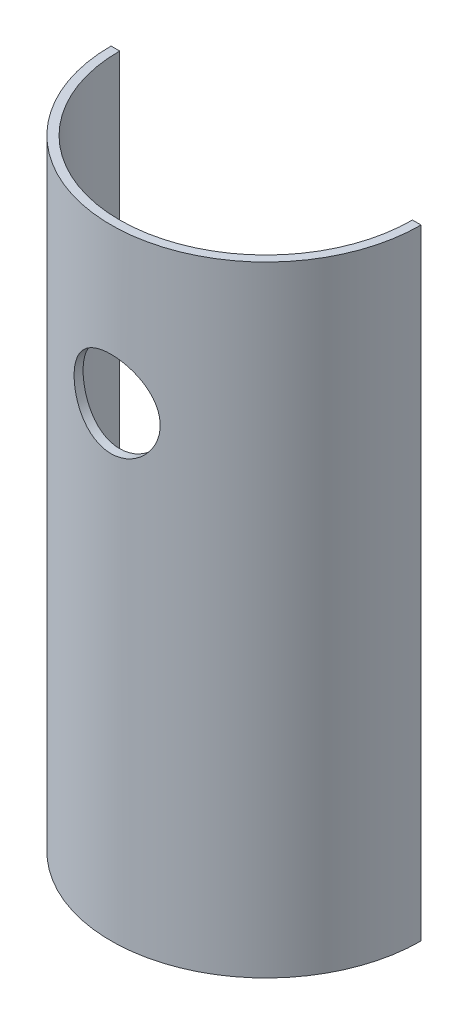
ISO-10303-21;
HEADER;
FILE_DESCRIPTION(('STEP AP214'),'2;1');
FILE_NAME('part.step','',(''),(''),'','','');
FILE_SCHEMA(('AUTOMOTIVE_DESIGN { 1 0 10303 214 1 1 1 1 }'));
ENDSEC;
DATA;
#1=APPLICATION_CONTEXT('core data for automotive mechanical design processes');
#2=APPLICATION_PROTOCOL_DEFINITION('international standard','automotive_design',2000,#1);
#3=PRODUCT_CONTEXT('',#1,'mechanical');
#4=PRODUCT('Part','Part','',(#3));
#5=PRODUCT_RELATED_PRODUCT_CATEGORY('part','',(#4));
#6=PRODUCT_DEFINITION_FORMATION('','',#4);
#7=PRODUCT_DEFINITION_CONTEXT('part definition',#1,'design');
#8=PRODUCT_DEFINITION('design','',#6,#7);
#9=PRODUCT_DEFINITION_SHAPE('','',#8);
#10=(LENGTH_UNIT() NAMED_UNIT(*) SI_UNIT(.MILLI.,.METRE.));
#11=(NAMED_UNIT(*) PLANE_ANGLE_UNIT() SI_UNIT($,.RADIAN.));
#12=(NAMED_UNIT(*) SI_UNIT($,.STERADIAN.) SOLID_ANGLE_UNIT());
#13=UNCERTAINTY_MEASURE_WITH_UNIT(LENGTH_MEASURE(1.E-05),#10,'distance_accuracy_value','');
#14=(GEOMETRIC_REPRESENTATION_CONTEXT(3) GLOBAL_UNCERTAINTY_ASSIGNED_CONTEXT((#13)) GLOBAL_UNIT_ASSIGNED_CONTEXT((#10,
#11,#12)) REPRESENTATION_CONTEXT('',''));
#15=CARTESIAN_POINT('',(0.,0.,0.));
#16=DIRECTION('',(0.,0.,1.));
#17=DIRECTION('',(1.,0.,0.));
#18=AXIS2_PLACEMENT_3D('',#15,#16,#17);
#19=CARTESIAN_POINT('',(0.,180.,0.));
#20=DIRECTION('',(0.,-1.,0.));
#21=DIRECTION('',(0.,0.,-1.));
#22=AXIS2_PLACEMENT_3D('',#19,#20,#21);
#23=CYLINDRICAL_SURFACE('',#22,42.5);
#24=CARTESIAN_POINT('',(0.,0.,0.));
#25=DIRECTION('',(0.,-1.,0.));
#26=DIRECTION('',(0.,0.,1.));
#27=AXIS2_PLACEMENT_3D('',#24,#25,#26);
#28=CIRCLE('',#27,42.5);
#29=CARTESIAN_POINT('',(42.5,0.,0.));
#30=VERTEX_POINT('',#29);
#31=CARTESIAN_POINT('',(-42.5,0.,0.));
#32=VERTEX_POINT('',#31);
#33=EDGE_CURVE('E115',#30,#32,#28,.T.);
#34=ORIENTED_EDGE('',*,*,#33,.T.);
#35=DIRECTION('',(0.,-1.,0.));
#36=VECTOR('',#35,1.);
#37=CARTESIAN_POINT('',(-42.5,180.,0.));
#38=LINE('',#37,#36);
#39=CARTESIAN_POINT('',(-42.5,180.,0.));
#40=VERTEX_POINT('',#39);
#41=EDGE_CURVE('E52',#40,#32,#38,.T.);
#42=ORIENTED_EDGE('',*,*,#41,.F.);
#43=CARTESIAN_POINT('',(0.,180.,0.));
#44=DIRECTION('',(0.,-1.,0.));
#45=DIRECTION('',(0.,0.,1.));
#46=AXIS2_PLACEMENT_3D('',#43,#44,#45);
#47=CIRCLE('',#46,42.5);
#48=CARTESIAN_POINT('',(42.5,180.,0.));
#49=VERTEX_POINT('',#48);
#50=EDGE_CURVE('E100',#49,#40,#47,.T.);
#51=ORIENTED_EDGE('',*,*,#50,.F.);
#52=DIRECTION('',(0.,-1.,0.));
#53=VECTOR('',#52,1.);
#54=CARTESIAN_POINT('',(42.5,180.,0.));
#55=LINE('',#54,#53);
#56=EDGE_CURVE('E107',#49,#30,#55,.T.);
#57=ORIENTED_EDGE('',*,*,#56,.T.);
#58=EDGE_LOOP('',(#34,#42,#51,#57));
#59=FACE_BOUND('',#58,.T.);
#60=CARTESIAN_POINT('',(-12.5,135.,40.6201920231798));
#61=CARTESIAN_POINT('',(-12.4999992072949,135.342830810471,40.6201925994515));
#62=CARTESIAN_POINT('',(-12.4858841301568,135.685675678334,40.6245440278572));
#63=CARTESIAN_POINT('',(-12.4295521652151,136.368839888144,40.6418145359453));
#64=CARTESIAN_POINT('',(-12.3873337257808,136.709159089595,40.6547340886871));
#65=CARTESIAN_POINT('',(-12.2751635698255,137.384888681938,40.6887427680351));
#66=CARTESIAN_POINT('',(-12.2052030853882,137.720297486105,40.7098344774158));
#67=CARTESIAN_POINT('',(-12.0381682765698,138.383713081229,40.7595397991203));
#68=CARTESIAN_POINT('',(-11.9410941847618,138.71171993565,40.7881533469236));
#69=CARTESIAN_POINT('',(-11.7208301118702,139.357563730348,40.8519920391727));
#70=CARTESIAN_POINT('',(-11.5976834275611,139.675416537795,40.8872062114807));
#71=CARTESIAN_POINT('',(-11.3261498461899,140.299445267628,40.9632541906434));
#72=CARTESIAN_POINT('',(-11.177762918839,140.605621176002,41.0040880042417));
#73=CARTESIAN_POINT('',(-10.8568553441672,141.204357571004,41.0902211656964));
#74=CARTESIAN_POINT('',(-10.684336523054,141.496919085686,41.1355201755677));
#75=CARTESIAN_POINT('',(-10.3162837452078,142.066780570639,41.2293628046926));
#76=CARTESIAN_POINT('',(-10.120741569564,142.344075038697,41.2779075799356));
#77=CARTESIAN_POINT('',(-9.70230498409948,142.889011032872,41.3782891527022));
#78=CARTESIAN_POINT('',(-9.47880820069915,143.156180293485,41.4301796958058));
#79=CARTESIAN_POINT('',(-9.010375016309,143.670884333718,41.5345724823251));
#80=CARTESIAN_POINT('',(-8.76543829394118,143.918418818912,41.5870747349));
#81=CARTESIAN_POINT('',(-8.25560178904064,144.392348355145,41.691278962363));
#82=CARTESIAN_POINT('',(-7.99069607998654,144.618737085422,41.7429806941361));
#83=CARTESIAN_POINT('',(-7.44274270184538,145.048722521297,41.84415328825));
#84=CARTESIAN_POINT('',(-7.15970140303307,145.252327161723,41.8936249236411));
#85=CARTESIAN_POINT('',(-6.57133115617571,145.639269075463,41.9899776394282));
#86=CARTESIAN_POINT('',(-6.26566924318702,145.82211844801,42.0367869412714));
#87=CARTESIAN_POINT('',(-5.63927919238109,146.161334482465,42.1253910411598));
#88=CARTESIAN_POINT('',(-5.31855079579938,146.317700689316,42.1671857530364));
#89=CARTESIAN_POINT('',(-4.66431065850731,146.602650032161,42.2445579638499));
#90=CARTESIAN_POINT('',(-4.33080097155201,146.731237609894,42.2801364565717));
#91=CARTESIAN_POINT('',(-3.65336776776556,146.959542232544,42.3440506860185));
#92=CARTESIAN_POINT('',(-3.30944459219739,147.059260222425,42.3723866598031));
#93=CARTESIAN_POINT('',(-2.62336150247549,147.226577399158,42.4203129312261));
#94=CARTESIAN_POINT('',(-2.28141423991457,147.294986068468,42.4401227449427));
#95=CARTESIAN_POINT('',(-1.5926295263714,147.403025691534,42.4715477420846));
#96=CARTESIAN_POINT('',(-1.24579215703655,147.442657125189,42.4831630621638));
#97=CARTESIAN_POINT('',(-0.549898337594368,147.492769393146,42.4978671484757));
#98=CARTESIAN_POINT('',(-0.200842286265633,147.503255325318,42.5009574058353));
#99=CARTESIAN_POINT('',(0.496890276245438,147.494991724982,42.498527037236));
#100=CARTESIAN_POINT('',(0.845566793993714,147.476242706551,42.4930065626906));
#101=CARTESIAN_POINT('',(1.52923469856878,147.410710333879,42.4738130193486));
#102=CARTESIAN_POINT('',(1.86431781617243,147.36480446687,42.4603951944752));
#103=CARTESIAN_POINT('',(2.52927899736873,147.246093668716,42.4259777227377));
#104=CARTESIAN_POINT('',(2.85915718579583,147.173289383727,42.4049782580003));
#105=CARTESIAN_POINT('',(3.5114628545144,147.001391592565,42.3559514228025));
#106=CARTESIAN_POINT('',(3.833890062433,146.902297126995,42.3279237958678));
#107=CARTESIAN_POINT('',(4.46914882359988,146.678617725004,42.2655720844761));
#108=CARTESIAN_POINT('',(4.78198019989299,146.554032318834,42.2312478839864));
#109=CARTESIAN_POINT('',(5.39952686200216,146.278771461991,42.1567662318997));
#110=CARTESIAN_POINT('',(5.70411000584718,146.127816359866,42.116547086137));
#111=CARTESIAN_POINT('',(6.29949840007052,145.801921104076,42.031616204798));
#112=CARTESIAN_POINT('',(6.59030359979865,145.626980862246,41.9869044527078));
#113=CARTESIAN_POINT('',(7.15637499035298,145.254322443372,41.8941352868334));
#114=CARTESIAN_POINT('',(7.43164078706359,145.056603688999,41.8460777882621));
#115=CARTESIAN_POINT('',(7.96507908189447,144.639614661117,41.7478275954451));
#116=CARTESIAN_POINT('',(8.22324546981538,144.420336752587,41.6976341483636));
#117=CARTESIAN_POINT('',(8.73006099121542,143.953164714687,41.5945352838799));
#118=CARTESIAN_POINT('',(8.97800519777773,143.704512254367,41.5415982159676));
#119=CARTESIAN_POINT('',(9.45216004677783,143.187172358438,41.4362844339928));
#120=CARTESIAN_POINT('',(9.67837047861922,142.918484728736,41.3839077253645));
#121=CARTESIAN_POINT('',(10.1076180354751,142.362701695363,41.2811674791934));
#122=CARTESIAN_POINT('',(10.3106484343203,142.075600986304,41.2308045287252));
#123=CARTESIAN_POINT('',(10.6919706799574,141.485003364489,41.1335687788191));
#124=CARTESIAN_POINT('',(10.8702716539187,141.181512558781,41.0866946946813));
#125=CARTESIAN_POINT('',(11.2024128794724,140.557167422733,40.9973878077705));
#126=CARTESIAN_POINT('',(11.3560147352719,140.23617977329,40.9549995006955));
#127=CARTESIAN_POINT('',(11.6355252337961,139.581614777966,40.8764681010412));
#128=CARTESIAN_POINT('',(11.7614335934332,139.248037303429,40.840325072303));
#129=CARTESIAN_POINT('',(11.9844340923883,138.570771292374,40.7754440402906));
#130=CARTESIAN_POINT('',(12.0815335891077,138.227085362108,40.7467041466015));
#131=CARTESIAN_POINT('',(12.2460594492823,137.532100080253,40.6975603351051));
#132=CARTESIAN_POINT('',(12.313486949959,137.180801020989,40.677156097824));
#133=CARTESIAN_POINT('',(12.4161397779416,136.486040468978,40.6459375846816));
#134=CARTESIAN_POINT('',(12.4524354496316,136.142751120702,40.6348049737288));
#135=CARTESIAN_POINT('',(12.4965088049888,135.454177362432,40.621272833323));
#136=CARTESIAN_POINT('',(12.5042871696481,135.108893000276,40.6188730953295));
#137=CARTESIAN_POINT('',(12.4912539724615,134.418959762099,40.622882935752));
#138=CARTESIAN_POINT('',(12.4704458759003,134.074310814122,40.6292914464217));
#139=CARTESIAN_POINT('',(12.4004418682984,133.388181980863,40.6507118928057));
#140=CARTESIAN_POINT('',(12.3512461773628,133.04670207103,40.6657237618132));
#141=CARTESIAN_POINT('',(12.2264855744119,132.377800796034,40.7034049387436));
#142=CARTESIAN_POINT('',(12.15160290245,132.050240607094,40.7258756849654));
#143=CARTESIAN_POINT('',(11.9759025414993,131.402738616078,40.7778879155933));
#144=CARTESIAN_POINT('',(11.8750853879402,131.08279665687,40.8074292540228));
#145=CARTESIAN_POINT('',(11.6483272362622,130.452626654875,40.8727339345571));
#146=CARTESIAN_POINT('',(11.52238761007,130.142398082716,40.908496936886));
#147=CARTESIAN_POINT('',(11.2462794395944,129.533465110737,40.9852622929058));
#148=CARTESIAN_POINT('',(11.0961022163342,129.234764886632,41.0262665222724));
#149=CARTESIAN_POINT('',(10.7684322860647,128.64326312009,41.1135055069873));
#150=CARTESIAN_POINT('',(10.5903350734712,128.35081229654,41.1598478728782));
#151=CARTESIAN_POINT('',(10.2110225293905,127.781833165611,41.2555846740171));
#152=CARTESIAN_POINT('',(10.0098064782128,127.505305354319,41.304979204257));
#153=CARTESIAN_POINT('',(9.58550005622279,126.969748209835,41.4055035767357));
#154=CARTESIAN_POINT('',(9.36240185076453,126.710725200506,41.4566340361876));
#155=CARTESIAN_POINT('',(8.89586644135312,126.211931944646,41.5592417887991));
#156=CARTESIAN_POINT('',(8.65243572200434,125.972155607296,41.6107189666018));
#157=CARTESIAN_POINT('',(8.13746328390199,125.504900663493,41.714543574648));
#158=CARTESIAN_POINT('',(7.86522194471288,125.278184294282,41.7668547757969));
#159=CARTESIAN_POINT('',(7.30217250462366,124.84846305403,41.8689637807171));
#160=CARTESIAN_POINT('',(7.01136391695919,124.645458805028,41.9187615185334));
#161=CARTESIAN_POINT('',(6.41308994346873,124.26463748366,42.0144502549995));
#162=CARTESIAN_POINT('',(6.10562496080502,124.086819802038,42.0603413481392));
#163=CARTESIAN_POINT('',(5.47609695282402,123.757735776429,42.1469250694124));
#164=CARTESIAN_POINT('',(5.15403420093729,123.606468935377,42.187617794862));
#165=CARTESIAN_POINT('',(4.50006280946733,123.332776124567,42.2623580341391));
#166=CARTESIAN_POINT('',(4.16824861514849,123.210137878791,42.2964541149756));
#167=CARTESIAN_POINT('',(3.49480591629483,122.993274230333,42.3574152310174));
#168=CARTESIAN_POINT('',(3.15317742176414,122.89904879869,42.3842802735934));
#169=CARTESIAN_POINT('',(2.4627162241275,122.739881057115,42.4299976438754));
#170=CARTESIAN_POINT('',(2.11388517900671,122.674932084801,42.4488517945472));
#171=CARTESIAN_POINT('',(1.4116160265035,122.574899405659,42.478004035934));
#172=CARTESIAN_POINT('',(1.05817806654492,122.539814745528,42.4883023997596));
#173=CARTESIAN_POINT('',(0.362614676610816,122.500587488018,42.4998233552925));
#174=CARTESIAN_POINT('',(0.0205561489412382,122.495344999906,42.5013685511498));
#175=CARTESIAN_POINT('',(-0.662771682807813,122.512905177235,42.4962052919225));
#176=CARTESIAN_POINT('',(-1.00404100746393,122.535707103032,42.4894970545143));
#177=CARTESIAN_POINT('',(-1.68329062082818,122.609147580143,42.4680114349342));
#178=CARTESIAN_POINT('',(-2.02127109417355,122.659784559504,42.4532345084326));
#179=CARTESIAN_POINT('',(-2.69154592407087,122.788446547958,42.4160140787485));
#180=CARTESIAN_POINT('',(-3.02384025741789,122.866471668793,42.3935705442867));
#181=CARTESIAN_POINT('',(-3.67713396319947,123.04832631805,42.3418822192987));
#182=CARTESIAN_POINT('',(-3.9982131192176,123.151889626281,42.3127077846704));
#183=CARTESIAN_POINT('',(-4.63040639522229,123.384373985944,42.2481988168736));
#184=CARTESIAN_POINT('',(-4.94152062409981,123.513294760176,42.2128643510456));
#185=CARTESIAN_POINT('',(-5.55179446950777,123.795510067485,42.1369450051152));
#186=CARTESIAN_POINT('',(-5.85095478477954,123.948803173314,42.0963604324863));
#187=CARTESIAN_POINT('',(-6.43562115267026,124.27873597003,42.0109522802599));
#188=CARTESIAN_POINT('',(-6.72112191860437,124.45538460229,41.9661270790698));
#189=CARTESIAN_POINT('',(-7.28518052160583,124.836559055322,41.8719523768282));
#190=CARTESIAN_POINT('',(-7.56325691795659,125.041773666869,41.8225062842602));
#191=CARTESIAN_POINT('',(-8.10137916069797,125.474408007316,41.7216088678952));
#192=CARTESIAN_POINT('',(-8.36141671980592,125.701837828144,41.6701566391874));
#193=CARTESIAN_POINT('',(-8.86179123019515,126.177425213329,41.5666207366953));
#194=CARTESIAN_POINT('',(-9.10212287544037,126.425588324275,41.5145368971481));
#195=CARTESIAN_POINT('',(-9.56140160388663,126.94092575035,41.4111699373973));
#196=CARTESIAN_POINT('',(-9.78035795436592,127.208091739139,41.3598864783629));
#197=CARTESIAN_POINT('',(-10.2015738622553,127.767844253385,41.2580440181421));
#198=CARTESIAN_POINT('',(-10.4031710952444,128.060941239291,41.2075483985199));
#199=CARTESIAN_POINT('',(-10.7808359229483,128.663598442065,41.1103588067384));
#200=CARTESIAN_POINT('',(-10.9569127606542,128.973152642651,41.0636634608942));
#201=CARTESIAN_POINT('',(-11.2822337651452,129.606673899323,40.9754757459392));
#202=CARTESIAN_POINT('',(-11.4314844140572,129.93063744995,40.9339821206494));
#203=CARTESIAN_POINT('',(-11.7019653128565,130.590781235401,40.8574813931784));
#204=CARTESIAN_POINT('',(-11.8231985269311,130.926960173504,40.8224736048865));
#205=CARTESIAN_POINT('',(-12.0239631164795,131.568730249272,40.7637572103138));
#206=CARTESIAN_POINT('',(-12.1067309746115,131.873235885916,40.7392018871398));
#207=CARTESIAN_POINT('',(-12.249069403347,132.488059657219,40.6966316750409));
#208=CARTESIAN_POINT('',(-12.3086418110566,132.798377329517,40.6786162681548));
#209=CARTESIAN_POINT('',(-12.4041344151284,133.422907121787,40.6495995700514));
#210=CARTESIAN_POINT('',(-12.4400583886947,133.737118611654,40.6385971587048));
#211=CARTESIAN_POINT('',(-12.4879924045184,134.367549319197,40.6238928576207));
#212=CARTESIAN_POINT('',(-12.5000007312008,134.683768679273,40.6201914916198));
#213=CARTESIAN_POINT('',(-12.5,135.,40.6201920231798));
#214=B_SPLINE_CURVE_WITH_KNOTS('',3,(#60,#61,#62,#63,#64,#65,#66,#67,#68,#69,#70,#71,#72,#73,
#74,#75,#76,#77,#78,#79,#80,#81,#82,#83,#84,#85,#86,#87,#88,#89,#90,#91,#92,#93,#94,#95,#96,#97,
#98,#99,#100,#101,#102,#103,#104,#105,#106,#107,#108,#109,#110,#111,#112,#113,#114,#115,#116,
#117,#118,#119,#120,#121,#122,#123,#124,#125,#126,#127,#128,#129,#130,#131,#132,#133,#134,#135,
#136,#137,#138,#139,#140,#141,#142,#143,#144,#145,#146,#147,#148,#149,#150,#151,#152,#153,#154,
#155,#156,#157,#158,#159,#160,#161,#162,#163,#164,#165,#166,#167,#168,#169,#170,#171,#172,#173,
#174,#175,#176,#177,#178,#179,#180,#181,#182,#183,#184,#185,#186,#187,#188,#189,#190,#191,#192,
#193,#194,#195,#196,#197,#198,#199,#200,#201,#202,#203,#204,#205,#206,#207,#208,#209,#210,#211,
#212,#213),.UNSPECIFIED.,.T.,.F.,(4,2,2,2,2,2,2,2,2,2,2,2,2,2,2,2,2,2,2,2,2,2,2,2,2,2,2,2,2,2,2,
2,2,2,2,2,2,2,2,2,2,2,2,2,2,2,2,2,2,2,2,2,2,2,2,2,2,2,2,2,2,2,2,2,2,2,2,2,2,2,2,2,2,2,2,2,4),
(0.,1.02820014144679,2.05645705614961,3.08503921239792,4.11361254602224,5.14049101859684,
6.16737072344879,7.19417276004068,8.22134246366199,9.27663980234698,10.3319529623194,
11.3875805673157,12.4428393859004,13.519244655047,14.5956684180485,15.6719199357591,
16.7481362214598,17.7946907976256,18.8412279206925,19.8875819813358,20.9339176427989,
21.9481608304355,22.962379655486,23.9766354971555,24.9909100313228,26.0166782201448,
27.0424501795819,28.0682481433159,29.0944107036781,30.1585182823654,31.2226361710254,
32.2870620550626,33.3510940279327,34.4248485506367,35.4986140489335,36.5721050852475,
37.6455549749007,38.6804214155035,39.7152631433797,40.7499794375859,41.784687709159,
42.7938061196645,43.8029036981124,44.8119461852793,45.8213507943936,46.8567841185461,
47.892249684525,48.9280873494733,49.9635959092468,51.0366892021391,52.1098106391165,
53.1829061131557,54.255981495362,55.3208277894631,56.3856729981593,57.450275759778,
58.5148445367456,59.5399091312164,60.5649466911733,61.5899263692639,62.6149102292597,
63.629630257451,64.6443391935834,65.6589887299751,66.6740278431901,67.7201959275804,
68.7668414954491,69.8137679650619,70.8602385039906,71.9368418822551,73.0130543560858,
74.0890064294559,75.1648446171327,76.1134276197883,77.0619354783096,78.0102918013229,
78.9587161516748),.UNSPECIFIED.);
#215=CARTESIAN_POINT('',(-12.5,135.,40.6201920231798));
#216=VERTEX_POINT('',#215);
#217=EDGE_CURVE('E113',#216,#216,#214,.T.);
#218=ORIENTED_EDGE('',*,*,#217,.F.);
#219=EDGE_LOOP('',(#218));
#220=FACE_BOUND('',#219,.T.);
#221=ADVANCED_FACE('F39',(#59,#220),#23,.F.);
#222=CARTESIAN_POINT('',(0.,180.,0.));
#223=DIRECTION('',(0.,-1.,0.));
#224=DIRECTION('',(0.,0.,-1.));
#225=AXIS2_PLACEMENT_3D('',#222,#223,#224);
#226=CYLINDRICAL_SURFACE('',#225,45.);
#227=CARTESIAN_POINT('',(0.,0.,0.));
#228=DIRECTION('',(0.,1.,0.));
#229=DIRECTION('',(0.,0.,1.));
#230=AXIS2_PLACEMENT_3D('',#227,#228,#229);
#231=CIRCLE('',#230,45.);
#232=CARTESIAN_POINT('',(-45.,0.,0.));
#233=VERTEX_POINT('',#232);
#234=CARTESIAN_POINT('',(45.,0.,0.));
#235=VERTEX_POINT('',#234);
#236=EDGE_CURVE('E79',#233,#235,#231,.T.);
#237=ORIENTED_EDGE('',*,*,#236,.T.);
#238=DIRECTION('',(0.,-1.,0.));
#239=VECTOR('',#238,1.);
#240=CARTESIAN_POINT('',(45.,180.,0.));
#241=LINE('',#240,#239);
#242=CARTESIAN_POINT('',(45.,180.,0.));
#243=VERTEX_POINT('',#242);
#244=EDGE_CURVE('E103',#243,#235,#241,.T.);
#245=ORIENTED_EDGE('',*,*,#244,.F.);
#246=CARTESIAN_POINT('',(0.,180.,0.));
#247=DIRECTION('',(0.,1.,0.));
#248=DIRECTION('',(0.,0.,1.));
#249=AXIS2_PLACEMENT_3D('',#246,#247,#248);
#250=CIRCLE('',#249,45.);
#251=CARTESIAN_POINT('',(-45.,180.,0.));
#252=VERTEX_POINT('',#251);
#253=EDGE_CURVE('E92',#252,#243,#250,.T.);
#254=ORIENTED_EDGE('',*,*,#253,.F.);
#255=DIRECTION('',(0.,-1.,0.));
#256=VECTOR('',#255,1.);
#257=CARTESIAN_POINT('',(-45.,180.,0.));
#258=LINE('',#257,#256);
#259=EDGE_CURVE('E99',#252,#233,#258,.T.);
#260=ORIENTED_EDGE('',*,*,#259,.T.);
#261=EDGE_LOOP('',(#237,#245,#254,#260));
#262=FACE_BOUND('',#261,.T.);
#263=CARTESIAN_POINT('',(0.,122.5,45.));
#264=CARTESIAN_POINT('',(0.344026701623803,122.500001071115,44.9999993500571));
#265=CARTESIAN_POINT('',(0.688073407491003,122.514214374797,44.996045254797));
#266=CARTESIAN_POINT('',(1.37365966888301,122.570945534912,44.9803364057621));
#267=CARTESIAN_POINT('',(1.71519902721711,122.613465593928,44.9685810449618));
#268=CARTESIAN_POINT('',(2.39340707246417,122.726458251792,44.9375886877897));
#269=CARTESIAN_POINT('',(2.730073898731,122.796941251234,44.9183489076996));
#270=CARTESIAN_POINT('',(3.39600814681062,122.965255243268,44.8729152485147));
#271=CARTESIAN_POINT('',(3.72527568578679,123.063085802498,44.8467214796164));
#272=CARTESIAN_POINT('',(4.37370338868398,123.285137558866,44.7881296560777));
#273=CARTESIAN_POINT('',(4.69287681272766,123.40932232736,44.7557401716248));
#274=CARTESIAN_POINT('',(5.31947065209178,123.683192034889,44.6855975768916));
#275=CARTESIAN_POINT('',(5.62689103416046,123.832877046061,44.6478444514379));
#276=CARTESIAN_POINT('',(6.22797048341566,124.156619588462,44.5679739801786));
#277=CARTESIAN_POINT('',(6.5216311923808,124.330674202019,44.525857156977));
#278=CARTESIAN_POINT('',(7.09350311432592,124.702015101834,44.4383385502585));
#279=CARTESIAN_POINT('',(7.37170877772116,124.899309654727,44.3929356000671));
#280=CARTESIAN_POINT('',(7.9168786229627,125.320418534604,44.2989982660347));
#281=CARTESIAN_POINT('',(8.18345368733571,125.544726202534,44.2504166257487));
#282=CARTESIAN_POINT('',(8.69687824192762,126.01470997859,44.1523796759978));
#283=CARTESIAN_POINT('',(8.9437274423315,126.260386400559,44.1029243537096));
#284=CARTESIAN_POINT('',(9.41619255749138,126.771604358206,44.0044722578783));
#285=CARTESIAN_POINT('',(9.64180184872876,127.037152044569,43.9554756316379));
#286=CARTESIAN_POINT('',(10.0701402363732,127.586263833869,43.8593257359927));
#287=CARTESIAN_POINT('',(10.2728772387467,127.869821658177,43.8121718333441));
#288=CARTESIAN_POINT('',(10.6578106647765,128.458808703726,43.7201440191767));
#289=CARTESIAN_POINT('',(10.8395416128665,128.764551907492,43.6753307408471));
#290=CARTESIAN_POINT('',(11.1765258272991,129.390923008316,43.5903141285554));
#291=CARTESIAN_POINT('',(11.3317786721114,129.711551142238,43.5501108679879));
#292=CARTESIAN_POINT('',(11.6145394184585,130.365420787111,43.4755548064646));
#293=CARTESIAN_POINT('',(11.7420516848401,130.69866030402,43.4412010852971));
#294=CARTESIAN_POINT('',(11.9682730830661,131.375401303521,43.3794214614504));
#295=CARTESIAN_POINT('',(12.0669830816589,131.718902476964,43.3519953503015));
#296=CARTESIAN_POINT('',(12.2326720612581,132.405143517573,43.3055303712945));
#297=CARTESIAN_POINT('',(12.3003650746545,132.747698306644,43.2863035593258));
#298=CARTESIAN_POINT('',(12.4068852502889,133.437621971437,43.2558929773107));
#299=CARTESIAN_POINT('',(12.445712839928,133.784990775803,43.2447090881753));
#300=CARTESIAN_POINT('',(12.4941391461697,134.481866727209,43.2307428210834));
#301=CARTESIAN_POINT('',(12.5037430556499,134.831373483287,43.2279589504931));
#302=CARTESIAN_POINT('',(12.4936460849407,135.529924391152,43.2308782852917));
#303=CARTESIAN_POINT('',(12.473945728052,135.878968551089,43.2365813391253));
#304=CARTESIAN_POINT('',(12.4064739648676,136.563331347273,43.2559889668564));
#305=CARTESIAN_POINT('',(12.3595775561144,136.89874378322,43.2694440452919));
#306=CARTESIAN_POINT('',(12.238824308539,137.564284975945,43.3037540341903));
#307=CARTESIAN_POINT('',(12.1649680996521,137.89441385599,43.3246087717546));
#308=CARTESIAN_POINT('',(11.9909050858351,138.547153550131,43.3731062537596));
#309=CARTESIAN_POINT('',(11.8906967295272,138.869763920388,43.4007493978344));
#310=CARTESIAN_POINT('',(11.6647267947976,139.5053195174,43.4620275701623));
#311=CARTESIAN_POINT('',(11.538964727734,139.818264559202,43.4956627129939));
#312=CARTESIAN_POINT('',(11.2611677307698,140.436196732792,43.5684169211726));
#313=CARTESIAN_POINT('',(11.1088342921829,140.741042410193,43.6075972204047));
#314=CARTESIAN_POINT('',(10.7800699211663,141.336866032037,43.6900308821975));
#315=CARTESIAN_POINT('',(10.6036388875827,141.62784391826,43.7332842618555));
#316=CARTESIAN_POINT('',(10.2278559463151,142.19419728372,43.8226911087504));
#317=CARTESIAN_POINT('',(10.0285002543308,142.469570175723,43.8688450542279));
#318=CARTESIAN_POINT('',(9.60818146245432,143.003009801592,43.9628162710744));
#319=CARTESIAN_POINT('',(9.38721737320559,143.261075742134,44.0106336185388));
#320=CARTESIAN_POINT('',(8.9168445814554,143.767179044383,44.1083846753811));
#321=CARTESIAN_POINT('',(8.66670397340122,144.014533847071,44.1583331943246));
#322=CARTESIAN_POINT('',(8.14636341394263,144.487378622424,44.2572806135809));
#323=CARTESIAN_POINT('',(7.87616297960165,144.712868068384,44.3062794909953));
#324=CARTESIAN_POINT('',(7.31743139349366,145.140461375991,44.401976551388));
#325=CARTESIAN_POINT('',(7.02889890601453,145.342563530557,44.4486745662795));
#326=CARTESIAN_POINT('',(6.43541437765022,145.721915285682,44.5384720775337));
#327=CARTESIAN_POINT('',(6.13046300965706,145.899165903656,44.5815717211834));
#328=CARTESIAN_POINT('',(5.50456629748775,146.228330479876,44.6631821605677));
#329=CARTESIAN_POINT('',(5.18354730439384,146.380110586799,44.7016684276972));
#330=CARTESIAN_POINT('',(4.52918896391242,146.656007883601,44.7727008306691));
#331=CARTESIAN_POINT('',(4.19584952382065,146.780124865281,44.8052469218041));
#332=CARTESIAN_POINT('',(3.51931878671957,146.999618151651,44.8634554111385));
#333=CARTESIAN_POINT('',(3.17612940767876,147.095000010579,44.8891191395308));
#334=CARTESIAN_POINT('',(2.48240180648224,147.256201694861,44.9328215236501));
#335=CARTESIAN_POINT('',(2.13186381178485,147.322022433795,44.9508604150205));
#336=CARTESIAN_POINT('',(1.43713226794747,147.421913994511,44.978347228059));
#337=CARTESIAN_POINT('',(1.0930814484062,147.456910358764,44.9880453628896));
#338=CARTESIAN_POINT('',(0.403133877317718,147.498276270459,44.9995167759947));
#339=CARTESIAN_POINT('',(0.0572371642804993,147.504646412796,45.001290218956));
#340=CARTESIAN_POINT('',(-0.63380585656504,147.488704073759,44.9968629206736));
#341=CARTESIAN_POINT('',(-0.978952237943419,147.466394544428,44.9906630001408));
#342=CARTESIAN_POINT('',(-1.66598278132153,147.393298107411,44.9704637088101));
#343=CARTESIAN_POINT('',(-2.00786696121187,147.342511355991,44.9564643808109));
#344=CARTESIAN_POINT('',(-2.67946496890153,147.214136658802,44.9213914008228));
#345=CARTESIAN_POINT('',(-3.00928667717405,147.137073954312,44.9004566017613));
#346=CARTESIAN_POINT('',(-3.66113796646817,146.956606442703,44.8520109691833));
#347=CARTESIAN_POINT('',(-3.98316767447572,146.853202065189,44.8245002429141));
#348=CARTESIAN_POINT('',(-4.61733042204482,146.620856648547,44.7636208031146));
#349=CARTESIAN_POINT('',(-4.92946266172287,146.491913551529,44.7302516175386));
#350=CARTESIAN_POINT('',(-5.54180987594929,146.209461989219,44.6585197770987));
#351=CARTESIAN_POINT('',(-5.84202459079804,146.055952988968,44.6201570134956));
#352=CARTESIAN_POINT('',(-6.43477457975839,145.72202329602,44.5385791837485));
#353=CARTESIAN_POINT('',(-6.72702045590792,145.541109477494,44.4952798223963));
#354=CARTESIAN_POINT('',(-7.29531631260128,145.156090128991,44.4056429599425));
#355=CARTESIAN_POINT('',(-7.57136611335624,144.95198434164,44.3593054251269));
#356=CARTESIAN_POINT('',(-8.10561655666061,144.521901104491,44.2648008576211));
#357=CARTESIAN_POINT('',(-8.36381383348119,144.295919549633,44.2166334825896));
#358=CARTESIAN_POINT('',(-8.86071497274607,143.823561883444,44.1197441169741));
#359=CARTESIAN_POINT('',(-9.09941853527089,143.577185458446,44.07102211787));
#360=CARTESIAN_POINT('',(-9.56288279163753,143.057676141825,43.9728224235264));
#361=CARTESIAN_POINT('',(-9.78698677612476,142.783952540263,43.9233677371978));
#362=CARTESIAN_POINT('',(-10.2113664344479,142.218242927911,43.8266514586243));
#363=CARTESIAN_POINT('',(-10.4116415681324,141.926256503369,43.7793899161083));
#364=CARTESIAN_POINT('',(-10.7869240709421,141.325943874182,43.6884373979282));
#365=CARTESIAN_POINT('',(-10.9619317966029,141.017617900179,43.6447463718861));
#366=CARTESIAN_POINT('',(-11.2853535622034,140.3866924325,43.5622389800075));
#367=CARTESIAN_POINT('',(-11.4337680218842,140.06409316421,43.5234225372347));
#368=CARTESIAN_POINT('',(-11.7020550023901,139.408694017518,43.4520550034023));
#369=CARTESIAN_POINT('',(-11.8220828780429,139.075961468809,43.4194700058601));
#370=CARTESIAN_POINT('',(-12.0336453319801,138.400951769256,43.3613126108784));
#371=CARTESIAN_POINT('',(-12.1251799250514,138.058674623365,43.3357402097994));
#372=CARTESIAN_POINT('',(-12.2789183095737,137.36718838289,43.2924306663633));
#373=CARTESIAN_POINT('',(-12.3411290476321,137.017980950487,43.2746916683929));
#374=CARTESIAN_POINT('',(-12.4356693848139,136.31522462952,43.2476190927477));
#375=CARTESIAN_POINT('',(-12.4679999183407,135.961675877065,43.2382852522301));
#376=CARTESIAN_POINT('',(-12.50185891222,135.265642120615,43.2285069354127));
#377=CARTESIAN_POINT('',(-12.5044451791386,134.923212425541,43.2277571843441));
#378=CARTESIAN_POINT('',(-12.4815258359724,134.23937941094,43.2343804970551));
#379=CARTESIAN_POINT('',(-12.4560209295031,133.89797606592,43.2417533573831));
#380=CARTESIAN_POINT('',(-12.377149561133,133.218685004499,43.2643946517818));
#381=CARTESIAN_POINT('',(-12.3237841084207,132.880797161208,43.2796627998625));
#382=CARTESIAN_POINT('',(-12.1896585052208,132.210931123846,43.3176300633296));
#383=CARTESIAN_POINT('',(-12.1088982171802,131.878952959457,43.340329216028));
#384=CARTESIAN_POINT('',(-11.9215254239243,131.226212071228,43.3922410254672));
#385=CARTESIAN_POINT('',(-11.815156167885,130.905374531447,43.421392198444));
#386=CARTESIAN_POINT('',(-11.5770286759189,130.273872199514,43.4854872084013));
#387=CARTESIAN_POINT('',(-11.4452706956161,129.963207304977,43.5204309870589));
#388=CARTESIAN_POINT('',(-11.1573515842614,129.354027787323,43.5951328696631));
#389=CARTESIAN_POINT('',(-11.0011916496883,129.055512569386,43.6348907375434));
#390=CARTESIAN_POINT('',(-10.6654957324373,128.472332127444,43.7181553334819));
#391=CARTESIAN_POINT('',(-10.4859508028523,128.187672261938,43.7616634942056));
#392=CARTESIAN_POINT('',(-10.0987429418314,127.625344478064,43.8526642165115));
#393=CARTESIAN_POINT('',(-9.89037548965637,127.348174764984,43.9002388896449));
#394=CARTESIAN_POINT('',(-9.45138609466949,126.81212009746,43.9968387569728));
#395=CARTESIAN_POINT('',(-9.22075401500954,126.553243565491,44.0458646047613));
#396=CARTESIAN_POINT('',(-8.73874377567826,126.055481636149,44.1440239262039));
#397=CARTESIAN_POINT('',(-8.48736065511608,125.816601046798,44.1931574228445));
#398=CARTESIAN_POINT('',(-7.9656019411188,125.360539929431,44.290174464198));
#399=CARTESIAN_POINT('',(-7.69523478788789,125.143349860661,44.3380585515659));
#400=CARTESIAN_POINT('',(-7.13031924096985,124.726994943605,44.4324489041466));
#401=CARTESIAN_POINT('',(-6.83534300864694,124.528396055524,44.4788934522516));
#402=CARTESIAN_POINT('',(-6.22921656984574,124.156884076736,44.5678205974511));
#403=CARTESIAN_POINT('',(-5.9180724237639,123.983961453942,44.6103046626489));
#404=CARTESIAN_POINT('',(-5.28173348336665,123.665102376553,44.6901116166552));
#405=CARTESIAN_POINT('',(-4.95654305438795,123.519157611107,44.7274360940398));
#406=CARTESIAN_POINT('',(-4.29433621333984,123.255398737981,44.7958638495366));
#407=CARTESIAN_POINT('',(-3.9573212542925,123.137581187762,44.8269678889036));
#408=CARTESIAN_POINT('',(-3.32361833325523,122.946093843966,44.8780508251523));
#409=CARTESIAN_POINT('',(-3.02818741263938,122.868496504368,44.8989895869454));
#410=CARTESIAN_POINT('',(-2.43200938551286,122.735064187306,44.9352257818034));
#411=CARTESIAN_POINT('',(-2.13126080976859,122.679235325743,44.9505216294143));
#412=CARTESIAN_POINT('',(-1.52626496766711,122.589761759125,44.9751282441821));
#413=CARTESIAN_POINT('',(-1.22201801470479,122.556115082436,44.9844395432655));
#414=CARTESIAN_POINT('',(-0.611852277150203,122.511237249166,44.9968747378273));
#415=CARTESIAN_POINT('',(-0.305934048337873,122.499999047485,45.0000005779774));
#416=CARTESIAN_POINT('',(0.,122.5,45.));
#417=B_SPLINE_CURVE_WITH_KNOTS('',3,(#263,#264,#265,#266,#267,#268,#269,#270,#271,#272,#273,
#274,#275,#276,#277,#278,#279,#280,#281,#282,#283,#284,#285,#286,#287,#288,#289,#290,#291,#292,
#293,#294,#295,#296,#297,#298,#299,#300,#301,#302,#303,#304,#305,#306,#307,#308,#309,#310,#311,
#312,#313,#314,#315,#316,#317,#318,#319,#320,#321,#322,#323,#324,#325,#326,#327,#328,#329,#330,
#331,#332,#333,#334,#335,#336,#337,#338,#339,#340,#341,#342,#343,#344,#345,#346,#347,#348,#349,
#350,#351,#352,#353,#354,#355,#356,#357,#358,#359,#360,#361,#362,#363,#364,#365,#366,#367,#368,
#369,#370,#371,#372,#373,#374,#375,#376,#377,#378,#379,#380,#381,#382,#383,#384,#385,#386,#387,
#388,#389,#390,#391,#392,#393,#394,#395,#396,#397,#398,#399,#400,#401,#402,#403,#404,#405,#406,
#407,#408,#409,#410,#411,#412,#413,#414,#415,#416),.UNSPECIFIED.,.T.,.F.,(4,2,2,2,2,2,2,2,2,2,2,
2,2,2,2,2,2,2,2,2,2,2,2,2,2,2,2,2,2,2,2,2,2,2,2,2,2,2,2,2,2,2,2,2,2,2,2,2,2,2,2,2,2,2,2,2,2,2,2,
2,2,2,2,2,2,2,2,2,2,2,2,2,2,2,2,2,4),(0.,1.03179975236364,2.06367979968148,3.0959440069454,
4.12819185737657,5.15902204920184,6.18985515724191,7.22056495333458,8.25164249481587,
9.30571670754589,10.3598064040289,11.4142237297584,12.4682754648068,13.5424293979676,
14.6166004300153,15.690602323965,16.7645718945716,17.8123939164214,18.8602004231951,
19.9078207299811,20.9554223291237,21.9710540327936,22.9866620070094,24.0023297844863,
25.0180169855415,26.0459511561524,27.0738896418349,28.1019980592677,29.1301535714688,
30.1948563402744,31.2595847499179,32.3243908270882,33.3891532986713,34.4593470030475,
35.5295487616552,36.5995435270208,37.6695052220855,38.7061221347745,39.7427175049102,
40.7792061851819,41.8156891778568,42.8325625354522,43.8494193099223,44.8663580553145,
45.8833189490813,46.9214215697896,47.9595357120538,48.997845038881,50.0361703375517,
51.1065059599065,52.1768658399634,53.247210615236,54.3175384949745,55.3818655999323,
56.4461921525381,57.5102664470697,58.5743074651147,59.6003854644678,60.626437763646,
61.6524528988614,62.678473185909,63.6951076422638,64.7117318632652,65.7283062526936,
66.7452707239299,67.7940858084351,68.843380679791,69.8929271335706,70.9420098833667,
72.0165742865912,73.0907387645158,74.16457177978,75.2382732992738,76.155938708518,
77.073861752406,77.9917031969637,78.9092560317428),.UNSPECIFIED.);
#418=CARTESIAN_POINT('',(0.,122.5,45.));
#419=VERTEX_POINT('',#418);
#420=EDGE_CURVE('E11',#419,#419,#417,.T.);
#421=ORIENTED_EDGE('',*,*,#420,.F.);
#422=EDGE_LOOP('',(#421));
#423=FACE_BOUND('',#422,.T.);
#424=ADVANCED_FACE('F104',(#262,#423),#226,.T.);
#425=CARTESIAN_POINT('',(-45.,180.,0.));
#426=DIRECTION('',(0.,0.,1.));
#427=DIRECTION('',(1.,0.,0.));
#428=AXIS2_PLACEMENT_3D('',#425,#426,#427);
#429=PLANE('',#428);
#430=DIRECTION('',(-1.,0.,0.));
#431=VECTOR('',#430,1.);
#432=CARTESIAN_POINT('',(-45.,0.,0.));
#433=LINE('',#432,#431);
#434=EDGE_CURVE('E105',#32,#233,#433,.T.);
#435=ORIENTED_EDGE('',*,*,#434,.T.);
#436=ORIENTED_EDGE('',*,*,#259,.F.);
#437=DIRECTION('',(-1.,0.,0.));
#438=VECTOR('',#437,1.);
#439=CARTESIAN_POINT('',(-45.,180.,0.));
#440=LINE('',#439,#438);
#441=EDGE_CURVE('E95',#40,#252,#440,.T.);
#442=ORIENTED_EDGE('',*,*,#441,.F.);
#443=ORIENTED_EDGE('',*,*,#41,.T.);
#444=EDGE_LOOP('',(#435,#436,#442,#443));
#445=FACE_BOUND('',#444,.T.);
#446=ADVANCED_FACE('F101',(#445),#429,.F.);
#447=CARTESIAN_POINT('',(42.5,180.,0.));
#448=DIRECTION('',(0.,0.,1.));
#449=DIRECTION('',(1.,0.,0.));
#450=AXIS2_PLACEMENT_3D('',#447,#448,#449);
#451=PLANE('',#450);
#452=DIRECTION('',(-1.,0.,0.));
#453=VECTOR('',#452,1.);
#454=CARTESIAN_POINT('',(42.5,0.,0.));
#455=LINE('',#454,#453);
#456=EDGE_CURVE('E84',#235,#30,#455,.T.);
#457=ORIENTED_EDGE('',*,*,#456,.T.);
#458=ORIENTED_EDGE('',*,*,#56,.F.);
#459=DIRECTION('',(-1.,0.,0.));
#460=VECTOR('',#459,1.);
#461=CARTESIAN_POINT('',(42.5,180.,0.));
#462=LINE('',#461,#460);
#463=EDGE_CURVE('E62',#243,#49,#462,.T.);
#464=ORIENTED_EDGE('',*,*,#463,.F.);
#465=ORIENTED_EDGE('',*,*,#244,.T.);
#466=EDGE_LOOP('',(#457,#458,#464,#465));
#467=FACE_BOUND('',#466,.T.);
#468=ADVANCED_FACE('F131',(#467),#451,.F.);
#469=CARTESIAN_POINT('',(0.,180.,0.));
#470=DIRECTION('',(0.,1.,0.));
#471=DIRECTION('',(0.,0.,1.));
#472=AXIS2_PLACEMENT_3D('',#469,#470,#471);
#473=PLANE('',#472);
#474=ORIENTED_EDGE('',*,*,#50,.T.);
#475=ORIENTED_EDGE('',*,*,#441,.T.);
#476=ORIENTED_EDGE('',*,*,#253,.T.);
#477=ORIENTED_EDGE('',*,*,#463,.T.);
#478=EDGE_LOOP('',(#474,#475,#476,#477));
#479=FACE_BOUND('',#478,.T.);
#480=ADVANCED_FACE('F91',(#479),#473,.T.);
#481=CARTESIAN_POINT('',(0.,0.,0.));
#482=DIRECTION('',(0.,1.,0.));
#483=DIRECTION('',(0.,0.,1.));
#484=AXIS2_PLACEMENT_3D('',#481,#482,#483);
#485=PLANE('',#484);
#486=ORIENTED_EDGE('',*,*,#33,.F.);
#487=ORIENTED_EDGE('',*,*,#456,.F.);
#488=ORIENTED_EDGE('',*,*,#236,.F.);
#489=ORIENTED_EDGE('',*,*,#434,.F.);
#490=EDGE_LOOP('',(#486,#487,#488,#489));
#491=FACE_BOUND('',#490,.T.);
#492=ADVANCED_FACE('F124',(#491),#485,.F.);
#493=CARTESIAN_POINT('',(0.,135.,45.));
#494=DIRECTION('',(0.,0.,-1.));
#495=DIRECTION('',(-1.,0.,0.));
#496=AXIS2_PLACEMENT_3D('',#493,#494,#495);
#497=CYLINDRICAL_SURFACE('',#496,12.5);
#498=ORIENTED_EDGE('',*,*,#420,.T.);
#499=EDGE_LOOP('',(#498));
#500=FACE_BOUND('',#499,.T.);
#501=ORIENTED_EDGE('',*,*,#217,.T.);
#502=EDGE_LOOP('',(#501));
#503=FACE_BOUND('',#502,.T.);
#504=ADVANCED_FACE('F127',(#500,#503),#497,.F.);
#505=CLOSED_SHELL('',(#221,#424,#446,#468,#480,#492,#504));
#506=MANIFOLD_SOLID_BREP('B2',#505);
#507=ADVANCED_BREP_SHAPE_REPRESENTATION('',(#18,#506),#14);
#508=SHAPE_DEFINITION_REPRESENTATION(#9,#507);
ENDSEC;
END-ISO-10303-21;
